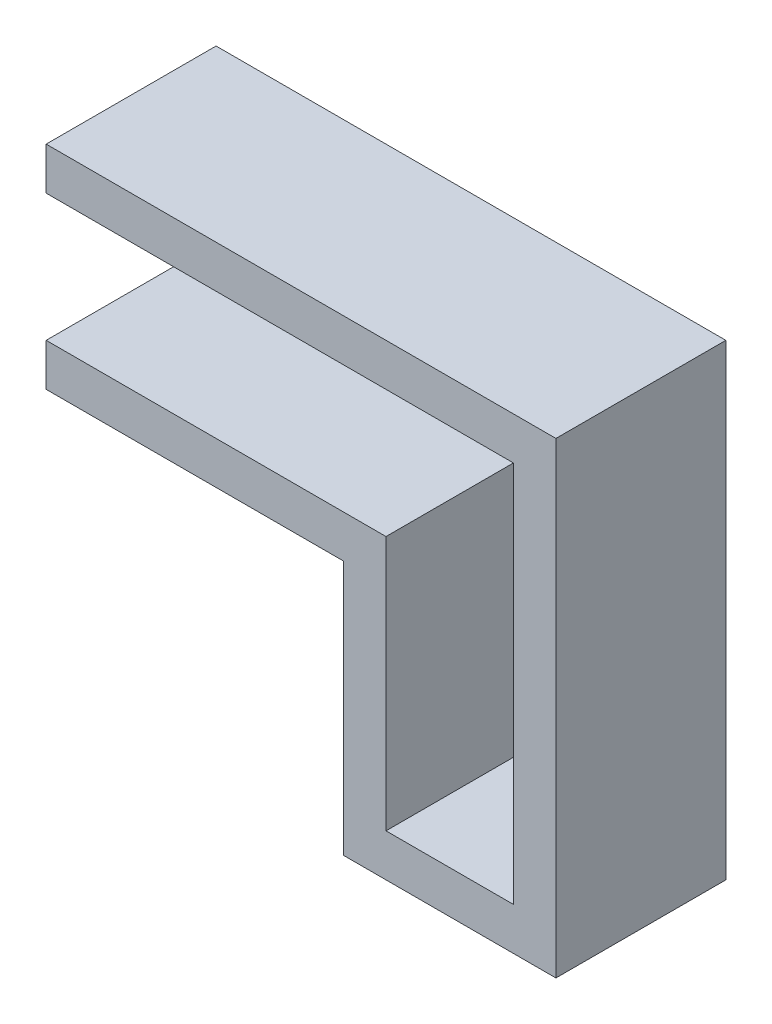
ISO-10303-21;
HEADER;
FILE_DESCRIPTION(('STEP AP214'),'2;1');
FILE_NAME('part.step','',(''),(''),'','','');
FILE_SCHEMA(('AUTOMOTIVE_DESIGN { 1 0 10303 214 1 1 1 1 }'));
ENDSEC;
DATA;
#1=APPLICATION_CONTEXT('core data for automotive mechanical design processes');
#2=APPLICATION_PROTOCOL_DEFINITION('international standard','automotive_design',2000,#1);
#3=PRODUCT_CONTEXT('',#1,'mechanical');
#4=PRODUCT('Part','Part','',(#3));
#5=PRODUCT_RELATED_PRODUCT_CATEGORY('part','',(#4));
#6=PRODUCT_DEFINITION_FORMATION('','',#4);
#7=PRODUCT_DEFINITION_CONTEXT('part definition',#1,'design');
#8=PRODUCT_DEFINITION('design','',#6,#7);
#9=PRODUCT_DEFINITION_SHAPE('','',#8);
#10=(LENGTH_UNIT() NAMED_UNIT(*) SI_UNIT(.MILLI.,.METRE.));
#11=(NAMED_UNIT(*) PLANE_ANGLE_UNIT() SI_UNIT($,.RADIAN.));
#12=(NAMED_UNIT(*) SI_UNIT($,.STERADIAN.) SOLID_ANGLE_UNIT());
#13=UNCERTAINTY_MEASURE_WITH_UNIT(LENGTH_MEASURE(1.E-05),#10,'distance_accuracy_value','');
#14=(GEOMETRIC_REPRESENTATION_CONTEXT(3) GLOBAL_UNCERTAINTY_ASSIGNED_CONTEXT((#13)) GLOBAL_UNIT_ASSIGNED_CONTEXT((#10,
#11,#12)) REPRESENTATION_CONTEXT('',''));
#15=CARTESIAN_POINT('',(0.,0.,0.));
#16=DIRECTION('',(0.,0.,1.));
#17=DIRECTION('',(1.,0.,0.));
#18=AXIS2_PLACEMENT_3D('',#15,#16,#17);
#19=CARTESIAN_POINT('',(120.,0.,40.));
#20=DIRECTION('',(1.,0.,0.));
#21=DIRECTION('',(0.,0.,-1.));
#22=AXIS2_PLACEMENT_3D('',#19,#20,#21);
#23=PLANE('',#22);
#24=DIRECTION('',(0.,-1.,0.));
#25=VECTOR('',#24,1.);
#26=CARTESIAN_POINT('',(120.,0.,0.));
#27=LINE('',#26,#25);
#28=CARTESIAN_POINT('',(120.,0.,0.));
#29=VERTEX_POINT('',#28);
#30=CARTESIAN_POINT('',(120.,-110.,0.));
#31=VERTEX_POINT('',#30);
#32=EDGE_CURVE('E133',#29,#31,#27,.T.);
#33=ORIENTED_EDGE('',*,*,#32,.F.);
#34=DIRECTION('',(0.,0.,-1.));
#35=VECTOR('',#34,1.);
#36=CARTESIAN_POINT('',(120.,0.,40.));
#37=LINE('',#36,#35);
#38=CARTESIAN_POINT('',(120.,0.,40.));
#39=VERTEX_POINT('',#38);
#40=EDGE_CURVE('E11',#39,#29,#37,.T.);
#41=ORIENTED_EDGE('',*,*,#40,.F.);
#42=DIRECTION('',(0.,-1.,0.));
#43=VECTOR('',#42,1.);
#44=CARTESIAN_POINT('',(120.,0.,40.));
#45=LINE('',#44,#43);
#46=CARTESIAN_POINT('',(120.,-110.,40.));
#47=VERTEX_POINT('',#46);
#48=EDGE_CURVE('E147',#39,#47,#45,.T.);
#49=ORIENTED_EDGE('',*,*,#48,.T.);
#50=DIRECTION('',(0.,0.,-1.));
#51=VECTOR('',#50,1.);
#52=CARTESIAN_POINT('',(120.,-110.,40.));
#53=LINE('',#52,#51);
#54=EDGE_CURVE('E89',#47,#31,#53,.T.);
#55=ORIENTED_EDGE('',*,*,#54,.T.);
#56=EDGE_LOOP('',(#33,#41,#49,#55));
#57=FACE_BOUND('',#56,.T.);
#58=ADVANCED_FACE('F39',(#57),#23,.T.);
#59=CARTESIAN_POINT('',(0.,0.,40.));
#60=DIRECTION('',(0.,1.,0.));
#61=DIRECTION('',(0.,0.,1.));
#62=AXIS2_PLACEMENT_3D('',#59,#60,#61);
#63=PLANE('',#62);
#64=DIRECTION('',(1.,0.,0.));
#65=VECTOR('',#64,1.);
#66=CARTESIAN_POINT('',(0.,0.,0.));
#67=LINE('',#66,#65);
#68=CARTESIAN_POINT('',(0.,0.,0.));
#69=VERTEX_POINT('',#68);
#70=EDGE_CURVE('E136',#69,#29,#67,.T.);
#71=ORIENTED_EDGE('',*,*,#70,.F.);
#72=DIRECTION('',(0.,0.,-1.));
#73=VECTOR('',#72,1.);
#74=CARTESIAN_POINT('',(0.,0.,40.));
#75=LINE('',#74,#73);
#76=CARTESIAN_POINT('',(0.,0.,40.));
#77=VERTEX_POINT('',#76);
#78=EDGE_CURVE('E46',#77,#69,#75,.T.);
#79=ORIENTED_EDGE('',*,*,#78,.F.);
#80=DIRECTION('',(1.,0.,0.));
#81=VECTOR('',#80,1.);
#82=CARTESIAN_POINT('',(0.,0.,40.));
#83=LINE('',#82,#81);
#84=EDGE_CURVE('E164',#77,#39,#83,.T.);
#85=ORIENTED_EDGE('',*,*,#84,.T.);
#86=ORIENTED_EDGE('',*,*,#40,.T.);
#87=EDGE_LOOP('',(#71,#79,#85,#86));
#88=FACE_BOUND('',#87,.T.);
#89=ADVANCED_FACE('F163',(#88),#63,.T.);
#90=CARTESIAN_POINT('',(0.,0.,40.));
#91=DIRECTION('',(1.,0.,0.));
#92=DIRECTION('',(0.,1.,0.));
#93=AXIS2_PLACEMENT_3D('',#90,#91,#92);
#94=PLANE('',#93);
#95=DIRECTION('',(0.,-1.,0.));
#96=VECTOR('',#95,1.);
#97=CARTESIAN_POINT('',(0.,0.,10.));
#98=LINE('',#97,#96);
#99=CARTESIAN_POINT('',(0.,-10.,10.));
#100=VERTEX_POINT('',#99);
#101=CARTESIAN_POINT('',(0.,-40.,10.));
#102=VERTEX_POINT('',#101);
#103=EDGE_CURVE('E227',#100,#102,#98,.T.);
#104=ORIENTED_EDGE('',*,*,#103,.F.);
#105=DIRECTION('',(0.,0.,1.));
#106=VECTOR('',#105,1.);
#107=CARTESIAN_POINT('',(0.,-10.,10.));
#108=LINE('',#107,#106);
#109=CARTESIAN_POINT('',(0.,-10.,40.));
#110=VERTEX_POINT('',#109);
#111=EDGE_CURVE('E137',#100,#110,#108,.T.);
#112=ORIENTED_EDGE('',*,*,#111,.T.);
#113=DIRECTION('',(0.,-1.,0.));
#114=VECTOR('',#113,1.);
#115=CARTESIAN_POINT('',(0.,0.,40.));
#116=LINE('',#115,#114);
#117=EDGE_CURVE('E115',#77,#110,#116,.T.);
#118=ORIENTED_EDGE('',*,*,#117,.F.);
#119=ORIENTED_EDGE('',*,*,#78,.T.);
#120=DIRECTION('',(0.,-1.,0.));
#121=VECTOR('',#120,1.);
#122=CARTESIAN_POINT('',(0.,0.,0.));
#123=LINE('',#122,#121);
#124=CARTESIAN_POINT('',(0.,-50.,0.));
#125=VERTEX_POINT('',#124);
#126=EDGE_CURVE('E140',#69,#125,#123,.T.);
#127=ORIENTED_EDGE('',*,*,#126,.T.);
#128=DIRECTION('',(0.,0.,-1.));
#129=VECTOR('',#128,1.);
#130=CARTESIAN_POINT('',(0.,-50.,40.));
#131=LINE('',#130,#129);
#132=CARTESIAN_POINT('',(0.,-50.,40.));
#133=VERTEX_POINT('',#132);
#134=EDGE_CURVE('E125',#133,#125,#131,.T.);
#135=ORIENTED_EDGE('',*,*,#134,.F.);
#136=CARTESIAN_POINT('',(0.,-40.,40.));
#137=VERTEX_POINT('',#136);
#138=EDGE_CURVE('E111',#137,#133,#116,.T.);
#139=ORIENTED_EDGE('',*,*,#138,.F.);
#140=DIRECTION('',(0.,0.,1.));
#141=VECTOR('',#140,1.);
#142=CARTESIAN_POINT('',(0.,-40.,10.));
#143=LINE('',#142,#141);
#144=EDGE_CURVE('E53',#102,#137,#143,.T.);
#145=ORIENTED_EDGE('',*,*,#144,.F.);
#146=EDGE_LOOP('',(#104,#112,#118,#119,#127,#135,#139,#145));
#147=FACE_BOUND('',#146,.T.);
#148=ADVANCED_FACE('F154',(#147),#94,.F.);
#149=CARTESIAN_POINT('',(0.,-50.,40.));
#150=DIRECTION('',(0.,1.,0.));
#151=DIRECTION('',(0.,0.,1.));
#152=AXIS2_PLACEMENT_3D('',#149,#150,#151);
#153=PLANE('',#152);
#154=DIRECTION('',(1.,0.,0.));
#155=VECTOR('',#154,1.);
#156=CARTESIAN_POINT('',(0.,-50.,0.));
#157=LINE('',#156,#155);
#158=CARTESIAN_POINT('',(70.,-50.,0.));
#159=VERTEX_POINT('',#158);
#160=EDGE_CURVE('E121',#125,#159,#157,.T.);
#161=ORIENTED_EDGE('',*,*,#160,.T.);
#162=DIRECTION('',(0.,0.,-1.));
#163=VECTOR('',#162,1.);
#164=CARTESIAN_POINT('',(70.,-50.,40.));
#165=LINE('',#164,#163);
#166=CARTESIAN_POINT('',(70.,-50.,40.));
#167=VERTEX_POINT('',#166);
#168=EDGE_CURVE('E118',#167,#159,#165,.T.);
#169=ORIENTED_EDGE('',*,*,#168,.F.);
#170=DIRECTION('',(1.,0.,0.));
#171=VECTOR('',#170,1.);
#172=CARTESIAN_POINT('',(0.,-50.,40.));
#173=LINE('',#172,#171);
#174=EDGE_CURVE('E104',#133,#167,#173,.T.);
#175=ORIENTED_EDGE('',*,*,#174,.F.);
#176=ORIENTED_EDGE('',*,*,#134,.T.);
#177=EDGE_LOOP('',(#161,#169,#175,#176));
#178=FACE_BOUND('',#177,.T.);
#179=ADVANCED_FACE('F119',(#178),#153,.F.);
#180=CARTESIAN_POINT('',(70.,0.,40.));
#181=DIRECTION('',(-1.,0.,0.));
#182=DIRECTION('',(0.,0.,1.));
#183=AXIS2_PLACEMENT_3D('',#180,#181,#182);
#184=PLANE('',#183);
#185=DIRECTION('',(0.,1.,0.));
#186=VECTOR('',#185,1.);
#187=CARTESIAN_POINT('',(70.,0.,0.));
#188=LINE('',#187,#186);
#189=CARTESIAN_POINT('',(70.,-110.,0.));
#190=VERTEX_POINT('',#189);
#191=EDGE_CURVE('E143',#190,#159,#188,.T.);
#192=ORIENTED_EDGE('',*,*,#191,.F.);
#193=DIRECTION('',(0.,0.,-1.));
#194=VECTOR('',#193,1.);
#195=CARTESIAN_POINT('',(70.,-110.,40.));
#196=LINE('',#195,#194);
#197=CARTESIAN_POINT('',(70.,-110.,40.));
#198=VERTEX_POINT('',#197);
#199=EDGE_CURVE('E126',#198,#190,#196,.T.);
#200=ORIENTED_EDGE('',*,*,#199,.F.);
#201=DIRECTION('',(0.,1.,0.));
#202=VECTOR('',#201,1.);
#203=CARTESIAN_POINT('',(70.,0.,40.));
#204=LINE('',#203,#202);
#205=EDGE_CURVE('E109',#198,#167,#204,.T.);
#206=ORIENTED_EDGE('',*,*,#205,.T.);
#207=ORIENTED_EDGE('',*,*,#168,.T.);
#208=EDGE_LOOP('',(#192,#200,#206,#207));
#209=FACE_BOUND('',#208,.T.);
#210=ADVANCED_FACE('F128',(#209),#184,.T.);
#211=CARTESIAN_POINT('',(0.,-110.,40.));
#212=DIRECTION('',(0.,1.,0.));
#213=DIRECTION('',(-1.,0.,0.));
#214=AXIS2_PLACEMENT_3D('',#211,#212,#213);
#215=PLANE('',#214);
#216=DIRECTION('',(1.,0.,0.));
#217=VECTOR('',#216,1.);
#218=CARTESIAN_POINT('',(0.,-110.,0.));
#219=LINE('',#218,#217);
#220=EDGE_CURVE('E145',#190,#31,#219,.T.);
#221=ORIENTED_EDGE('',*,*,#220,.T.);
#222=ORIENTED_EDGE('',*,*,#54,.F.);
#223=DIRECTION('',(1.,0.,0.));
#224=VECTOR('',#223,1.);
#225=CARTESIAN_POINT('',(0.,-110.,40.));
#226=LINE('',#225,#224);
#227=EDGE_CURVE('E62',#198,#47,#226,.T.);
#228=ORIENTED_EDGE('',*,*,#227,.F.);
#229=ORIENTED_EDGE('',*,*,#199,.T.);
#230=EDGE_LOOP('',(#221,#222,#228,#229));
#231=FACE_BOUND('',#230,.T.);
#232=ADVANCED_FACE('F167',(#231),#215,.F.);
#233=CARTESIAN_POINT('',(0.,0.,40.));
#234=DIRECTION('',(0.,0.,1.));
#235=DIRECTION('',(1.,0.,0.));
#236=AXIS2_PLACEMENT_3D('',#233,#234,#235);
#237=PLANE('',#236);
#238=DIRECTION('',(-1.,0.,0.));
#239=VECTOR('',#238,1.);
#240=CARTESIAN_POINT('',(0.,-10.,40.));
#241=LINE('',#240,#239);
#242=CARTESIAN_POINT('',(110.,-10.,40.));
#243=VERTEX_POINT('',#242);
#244=EDGE_CURVE('E175',#243,#110,#241,.T.);
#245=ORIENTED_EDGE('',*,*,#244,.F.);
#246=DIRECTION('',(0.,1.,0.));
#247=VECTOR('',#246,1.);
#248=CARTESIAN_POINT('',(110.,0.,40.));
#249=LINE('',#248,#247);
#250=CARTESIAN_POINT('',(110.,-100.,40.));
#251=VERTEX_POINT('',#250);
#252=EDGE_CURVE('E243',#251,#243,#249,.T.);
#253=ORIENTED_EDGE('',*,*,#252,.F.);
#254=DIRECTION('',(1.,0.,0.));
#255=VECTOR('',#254,1.);
#256=CARTESIAN_POINT('',(0.,-100.,40.));
#257=LINE('',#256,#255);
#258=CARTESIAN_POINT('',(80.,-100.,40.));
#259=VERTEX_POINT('',#258);
#260=EDGE_CURVE('E240',#259,#251,#257,.T.);
#261=ORIENTED_EDGE('',*,*,#260,.F.);
#262=DIRECTION('',(0.,1.,0.));
#263=VECTOR('',#262,1.);
#264=CARTESIAN_POINT('',(80.,0.,40.));
#265=LINE('',#264,#263);
#266=CARTESIAN_POINT('',(80.,-40.,40.));
#267=VERTEX_POINT('',#266);
#268=EDGE_CURVE('E238',#259,#267,#265,.T.);
#269=ORIENTED_EDGE('',*,*,#268,.T.);
#270=DIRECTION('',(1.,0.,0.));
#271=VECTOR('',#270,1.);
#272=CARTESIAN_POINT('',(0.,-40.,40.));
#273=LINE('',#272,#271);
#274=EDGE_CURVE('E223',#137,#267,#273,.T.);
#275=ORIENTED_EDGE('',*,*,#274,.F.);
#276=ORIENTED_EDGE('',*,*,#138,.T.);
#277=ORIENTED_EDGE('',*,*,#174,.T.);
#278=ORIENTED_EDGE('',*,*,#205,.F.);
#279=ORIENTED_EDGE('',*,*,#227,.T.);
#280=ORIENTED_EDGE('',*,*,#48,.F.);
#281=ORIENTED_EDGE('',*,*,#84,.F.);
#282=ORIENTED_EDGE('',*,*,#117,.T.);
#283=EDGE_LOOP('',(#245,#253,#261,#269,#275,#276,#277,#278,#279,#280,#281,#282));
#284=FACE_BOUND('',#283,.T.);
#285=ADVANCED_FACE('F107',(#284),#237,.T.);
#286=CARTESIAN_POINT('',(0.,0.,0.));
#287=DIRECTION('',(0.,0.,1.));
#288=DIRECTION('',(1.,0.,0.));
#289=AXIS2_PLACEMENT_3D('',#286,#287,#288);
#290=PLANE('',#289);
#291=ORIENTED_EDGE('',*,*,#32,.T.);
#292=ORIENTED_EDGE('',*,*,#220,.F.);
#293=ORIENTED_EDGE('',*,*,#191,.T.);
#294=ORIENTED_EDGE('',*,*,#160,.F.);
#295=ORIENTED_EDGE('',*,*,#126,.F.);
#296=ORIENTED_EDGE('',*,*,#70,.T.);
#297=EDGE_LOOP('',(#291,#292,#293,#294,#295,#296));
#298=FACE_BOUND('',#297,.T.);
#299=ADVANCED_FACE('F162',(#298),#290,.F.);
#300=CARTESIAN_POINT('',(0.,-10.,10.));
#301=DIRECTION('',(0.,1.,0.));
#302=DIRECTION('',(-1.,0.,0.));
#303=AXIS2_PLACEMENT_3D('',#300,#301,#302);
#304=PLANE('',#303);
#305=ORIENTED_EDGE('',*,*,#244,.T.);
#306=ORIENTED_EDGE('',*,*,#111,.F.);
#307=DIRECTION('',(-1.,0.,0.));
#308=VECTOR('',#307,1.);
#309=CARTESIAN_POINT('',(0.,-10.,10.));
#310=LINE('',#309,#308);
#311=CARTESIAN_POINT('',(110.,-10.,10.));
#312=VERTEX_POINT('',#311);
#313=EDGE_CURVE('E235',#312,#100,#310,.T.);
#314=ORIENTED_EDGE('',*,*,#313,.F.);
#315=DIRECTION('',(0.,0.,1.));
#316=VECTOR('',#315,1.);
#317=CARTESIAN_POINT('',(110.,-10.,10.));
#318=LINE('',#317,#316);
#319=EDGE_CURVE('E185',#312,#243,#318,.T.);
#320=ORIENTED_EDGE('',*,*,#319,.T.);
#321=EDGE_LOOP('',(#305,#306,#314,#320));
#322=FACE_BOUND('',#321,.T.);
#323=ADVANCED_FACE('F256',(#322),#304,.F.);
#324=CARTESIAN_POINT('',(110.,0.,10.));
#325=DIRECTION('',(1.,0.,0.));
#326=DIRECTION('',(0.,1.,0.));
#327=AXIS2_PLACEMENT_3D('',#324,#325,#326);
#328=PLANE('',#327);
#329=ORIENTED_EDGE('',*,*,#252,.T.);
#330=ORIENTED_EDGE('',*,*,#319,.F.);
#331=DIRECTION('',(0.,1.,0.));
#332=VECTOR('',#331,1.);
#333=CARTESIAN_POINT('',(110.,0.,10.));
#334=LINE('',#333,#332);
#335=CARTESIAN_POINT('',(110.,-100.,10.));
#336=VERTEX_POINT('',#335);
#337=EDGE_CURVE('E232',#336,#312,#334,.T.);
#338=ORIENTED_EDGE('',*,*,#337,.F.);
#339=DIRECTION('',(0.,0.,1.));
#340=VECTOR('',#339,1.);
#341=CARTESIAN_POINT('',(110.,-100.,10.));
#342=LINE('',#341,#340);
#343=EDGE_CURVE('E248',#336,#251,#342,.T.);
#344=ORIENTED_EDGE('',*,*,#343,.T.);
#345=EDGE_LOOP('',(#329,#330,#338,#344));
#346=FACE_BOUND('',#345,.T.);
#347=ADVANCED_FACE('F254',(#346),#328,.F.);
#348=CARTESIAN_POINT('',(0.,-100.,10.));
#349=DIRECTION('',(0.,-1.,0.));
#350=DIRECTION('',(0.,0.,-1.));
#351=AXIS2_PLACEMENT_3D('',#348,#349,#350);
#352=PLANE('',#351);
#353=ORIENTED_EDGE('',*,*,#260,.T.);
#354=ORIENTED_EDGE('',*,*,#343,.F.);
#355=DIRECTION('',(1.,0.,0.));
#356=VECTOR('',#355,1.);
#357=CARTESIAN_POINT('',(0.,-100.,10.));
#358=LINE('',#357,#356);
#359=CARTESIAN_POINT('',(80.,-100.,10.));
#360=VERTEX_POINT('',#359);
#361=EDGE_CURVE('E218',#360,#336,#358,.T.);
#362=ORIENTED_EDGE('',*,*,#361,.F.);
#363=DIRECTION('',(0.,0.,1.));
#364=VECTOR('',#363,1.);
#365=CARTESIAN_POINT('',(80.,-100.,10.));
#366=LINE('',#365,#364);
#367=EDGE_CURVE('E213',#360,#259,#366,.T.);
#368=ORIENTED_EDGE('',*,*,#367,.T.);
#369=EDGE_LOOP('',(#353,#354,#362,#368));
#370=FACE_BOUND('',#369,.T.);
#371=ADVANCED_FACE('F251',(#370),#352,.F.);
#372=CARTESIAN_POINT('',(80.,0.,10.));
#373=DIRECTION('',(1.,0.,0.));
#374=DIRECTION('',(0.,0.,-1.));
#375=AXIS2_PLACEMENT_3D('',#372,#373,#374);
#376=PLANE('',#375);
#377=ORIENTED_EDGE('',*,*,#268,.F.);
#378=ORIENTED_EDGE('',*,*,#367,.F.);
#379=DIRECTION('',(0.,1.,0.));
#380=VECTOR('',#379,1.);
#381=CARTESIAN_POINT('',(80.,0.,10.));
#382=LINE('',#381,#380);
#383=CARTESIAN_POINT('',(80.,-40.,10.));
#384=VERTEX_POINT('',#383);
#385=EDGE_CURVE('E208',#360,#384,#382,.T.);
#386=ORIENTED_EDGE('',*,*,#385,.T.);
#387=DIRECTION('',(0.,0.,1.));
#388=VECTOR('',#387,1.);
#389=CARTESIAN_POINT('',(80.,-40.,10.));
#390=LINE('',#389,#388);
#391=EDGE_CURVE('E212',#384,#267,#390,.T.);
#392=ORIENTED_EDGE('',*,*,#391,.T.);
#393=EDGE_LOOP('',(#377,#378,#386,#392));
#394=FACE_BOUND('',#393,.T.);
#395=ADVANCED_FACE('F211',(#394),#376,.T.);
#396=CARTESIAN_POINT('',(0.,-40.,10.));
#397=DIRECTION('',(0.,-1.,0.));
#398=DIRECTION('',(0.,0.,-1.));
#399=AXIS2_PLACEMENT_3D('',#396,#397,#398);
#400=PLANE('',#399);
#401=ORIENTED_EDGE('',*,*,#274,.T.);
#402=ORIENTED_EDGE('',*,*,#391,.F.);
#403=DIRECTION('',(1.,0.,0.));
#404=VECTOR('',#403,1.);
#405=CARTESIAN_POINT('',(0.,-40.,10.));
#406=LINE('',#405,#404);
#407=EDGE_CURVE('E219',#102,#384,#406,.T.);
#408=ORIENTED_EDGE('',*,*,#407,.F.);
#409=ORIENTED_EDGE('',*,*,#144,.T.);
#410=EDGE_LOOP('',(#401,#402,#408,#409));
#411=FACE_BOUND('',#410,.T.);
#412=ADVANCED_FACE('F221',(#411),#400,.F.);
#413=CARTESIAN_POINT('',(0.,0.,10.));
#414=DIRECTION('',(0.,0.,1.));
#415=DIRECTION('',(1.,0.,0.));
#416=AXIS2_PLACEMENT_3D('',#413,#414,#415);
#417=PLANE('',#416);
#418=ORIENTED_EDGE('',*,*,#103,.T.);
#419=ORIENTED_EDGE('',*,*,#407,.T.);
#420=ORIENTED_EDGE('',*,*,#385,.F.);
#421=ORIENTED_EDGE('',*,*,#361,.T.);
#422=ORIENTED_EDGE('',*,*,#337,.T.);
#423=ORIENTED_EDGE('',*,*,#313,.T.);
#424=EDGE_LOOP('',(#418,#419,#420,#421,#422,#423));
#425=FACE_BOUND('',#424,.T.);
#426=ADVANCED_FACE('F225',(#425),#417,.T.);
#427=CLOSED_SHELL('',(#58,#89,#148,#179,#210,#232,#285,#299,#323,#347,#371,#395,#412,#426));
#428=MANIFOLD_SOLID_BREP('B2',#427);
#429=ADVANCED_BREP_SHAPE_REPRESENTATION('',(#18,#428),#14);
#430=SHAPE_DEFINITION_REPRESENTATION(#9,#429);
ENDSEC;
END-ISO-10303-21;
